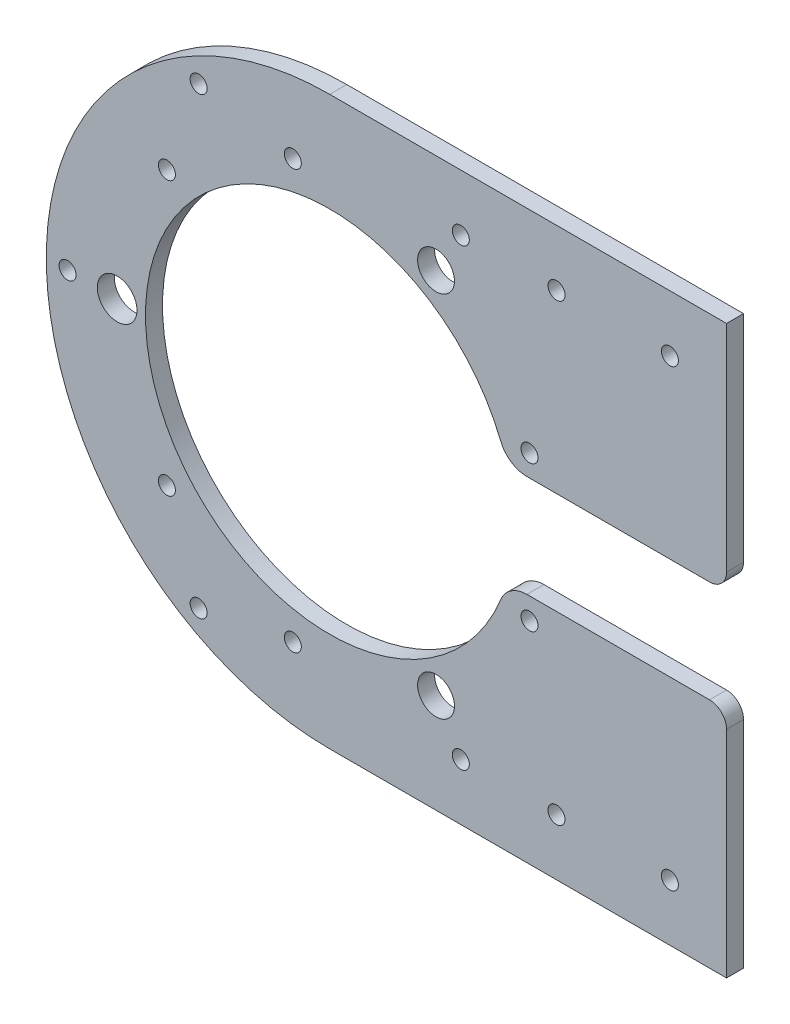
ISO-10303-21;
HEADER;
FILE_DESCRIPTION(('STEP AP214'),'2;1');
FILE_NAME('part.step','',(''),(''),'','','');
FILE_SCHEMA(('AUTOMOTIVE_DESIGN { 1 0 10303 214 1 1 1 1 }'));
ENDSEC;
DATA;
#1=APPLICATION_CONTEXT('core data for automotive mechanical design processes');
#2=APPLICATION_PROTOCOL_DEFINITION('international standard','automotive_design',2000,#1);
#3=PRODUCT_CONTEXT('',#1,'mechanical');
#4=PRODUCT('Part','Part','',(#3));
#5=PRODUCT_RELATED_PRODUCT_CATEGORY('part','',(#4));
#6=PRODUCT_DEFINITION_FORMATION('','',#4);
#7=PRODUCT_DEFINITION_CONTEXT('part definition',#1,'design');
#8=PRODUCT_DEFINITION('design','',#6,#7);
#9=PRODUCT_DEFINITION_SHAPE('','',#8);
#10=(LENGTH_UNIT() NAMED_UNIT(*) SI_UNIT(.MILLI.,.METRE.));
#11=(NAMED_UNIT(*) PLANE_ANGLE_UNIT() SI_UNIT($,.RADIAN.));
#12=(NAMED_UNIT(*) SI_UNIT($,.STERADIAN.) SOLID_ANGLE_UNIT());
#13=UNCERTAINTY_MEASURE_WITH_UNIT(LENGTH_MEASURE(1.E-05),#10,'distance_accuracy_value','');
#14=(GEOMETRIC_REPRESENTATION_CONTEXT(3) GLOBAL_UNCERTAINTY_ASSIGNED_CONTEXT((#13)) GLOBAL_UNIT_ASSIGNED_CONTEXT((#10,
#11,#12)) REPRESENTATION_CONTEXT('',''));
#15=CARTESIAN_POINT('',(0.,0.,0.));
#16=DIRECTION('',(0.,0.,1.));
#17=DIRECTION('',(1.,0.,0.));
#18=AXIS2_PLACEMENT_3D('',#15,#16,#17);
#19=CARTESIAN_POINT('',(-280.,0.,-7.));
#20=DIRECTION('',(1.,0.,0.));
#21=DIRECTION('',(0.,0.,-1.));
#22=AXIS2_PLACEMENT_3D('',#19,#20,#21);
#23=PLANE('',#22);
#24=DIRECTION('',(0.,1.,0.));
#25=VECTOR('',#24,1.);
#26=CARTESIAN_POINT('',(-280.,0.,3.));
#27=LINE('',#26,#25);
#28=CARTESIAN_POINT('',(-280.,12.,3.));
#29=VERTEX_POINT('',#28);
#30=CARTESIAN_POINT('',(-280.,50.,3.));
#31=VERTEX_POINT('',#30);
#32=EDGE_CURVE('E140',#29,#31,#27,.T.);
#33=ORIENTED_EDGE('',*,*,#32,.F.);
#34=DIRECTION('',(0.,0.,1.));
#35=VECTOR('',#34,1.);
#36=CARTESIAN_POINT('',(-280.,12.,0.));
#37=LINE('',#36,#35);
#38=CARTESIAN_POINT('',(-280.,12.,0.));
#39=VERTEX_POINT('',#38);
#40=EDGE_CURVE('E11',#29,#39,#37,.F.);
#41=ORIENTED_EDGE('',*,*,#40,.T.);
#42=DIRECTION('',(0.,1.,0.));
#43=VECTOR('',#42,1.);
#44=CARTESIAN_POINT('',(-280.,0.,0.));
#45=LINE('',#44,#43);
#46=CARTESIAN_POINT('',(-280.,50.,0.));
#47=VERTEX_POINT('',#46);
#48=EDGE_CURVE('E248',#39,#47,#45,.T.);
#49=ORIENTED_EDGE('',*,*,#48,.T.);
#50=DIRECTION('',(0.,0.,1.));
#51=VECTOR('',#50,1.);
#52=CARTESIAN_POINT('',(-280.,50.,-7.));
#53=LINE('',#52,#51);
#54=EDGE_CURVE('E149',#47,#31,#53,.T.);
#55=ORIENTED_EDGE('',*,*,#54,.T.);
#56=EDGE_LOOP('',(#33,#41,#49,#55));
#57=FACE_BOUND('',#56,.T.);
#58=ADVANCED_FACE('F43',(#57),#23,.T.);
#59=CARTESIAN_POINT('',(0.,50.,3.));
#60=DIRECTION('',(0.,-1.,0.));
#61=DIRECTION('',(1.,0.,0.));
#62=AXIS2_PLACEMENT_3D('',#59,#60,#61);
#63=PLANE('',#62);
#64=ORIENTED_EDGE('',*,*,#54,.F.);
#65=DIRECTION('',(-1.,0.,0.));
#66=VECTOR('',#65,1.);
#67=CARTESIAN_POINT('',(0.,50.,0.));
#68=LINE('',#67,#66);
#69=CARTESIAN_POINT('',(-350.,50.,0.));
#70=VERTEX_POINT('',#69);
#71=EDGE_CURVE('E183',#47,#70,#68,.T.);
#72=ORIENTED_EDGE('',*,*,#71,.T.);
#73=DIRECTION('',(0.,0.,-1.));
#74=VECTOR('',#73,1.);
#75=CARTESIAN_POINT('',(-350.,50.,3.));
#76=LINE('',#75,#74);
#77=CARTESIAN_POINT('',(-350.,50.,3.));
#78=VERTEX_POINT('',#77);
#79=EDGE_CURVE('E212',#78,#70,#76,.T.);
#80=ORIENTED_EDGE('',*,*,#79,.F.);
#81=DIRECTION('',(-1.,0.,0.));
#82=VECTOR('',#81,1.);
#83=CARTESIAN_POINT('',(0.,50.,3.));
#84=LINE('',#83,#82);
#85=EDGE_CURVE('E161',#31,#78,#84,.T.);
#86=ORIENTED_EDGE('',*,*,#85,.F.);
#87=EDGE_LOOP('',(#64,#72,#80,#86));
#88=FACE_BOUND('',#87,.T.);
#89=ADVANCED_FACE('F286',(#88),#63,.F.);
#90=CARTESIAN_POINT('',(0.,-50.,3.));
#91=DIRECTION('',(0.,-1.,0.));
#92=DIRECTION('',(1.,0.,0.));
#93=AXIS2_PLACEMENT_3D('',#90,#91,#92);
#94=PLANE('',#93);
#95=DIRECTION('',(-1.,0.,0.));
#96=VECTOR('',#95,1.);
#97=CARTESIAN_POINT('',(0.,-50.,0.));
#98=LINE('',#97,#96);
#99=CARTESIAN_POINT('',(-280.,-50.,0.));
#100=VERTEX_POINT('',#99);
#101=CARTESIAN_POINT('',(-350.,-50.,0.));
#102=VERTEX_POINT('',#101);
#103=EDGE_CURVE('E148',#100,#102,#98,.T.);
#104=ORIENTED_EDGE('',*,*,#103,.F.);
#105=DIRECTION('',(0.,0.,1.));
#106=VECTOR('',#105,1.);
#107=CARTESIAN_POINT('',(-280.,-50.,-7.));
#108=LINE('',#107,#106);
#109=CARTESIAN_POINT('',(-280.,-50.,3.));
#110=VERTEX_POINT('',#109);
#111=EDGE_CURVE('E134',#100,#110,#108,.T.);
#112=ORIENTED_EDGE('',*,*,#111,.T.);
#113=DIRECTION('',(-1.,0.,0.));
#114=VECTOR('',#113,1.);
#115=CARTESIAN_POINT('',(0.,-50.,3.));
#116=LINE('',#115,#114);
#117=CARTESIAN_POINT('',(-350.,-50.,3.));
#118=VERTEX_POINT('',#117);
#119=EDGE_CURVE('E146',#110,#118,#116,.T.);
#120=ORIENTED_EDGE('',*,*,#119,.T.);
#121=DIRECTION('',(0.,0.,-1.));
#122=VECTOR('',#121,1.);
#123=CARTESIAN_POINT('',(-350.,-50.,3.));
#124=LINE('',#123,#122);
#125=EDGE_CURVE('E182',#118,#102,#124,.T.);
#126=ORIENTED_EDGE('',*,*,#125,.T.);
#127=EDGE_LOOP('',(#104,#112,#120,#126));
#128=FACE_BOUND('',#127,.T.);
#129=ADVANCED_FACE('F144',(#128),#94,.T.);
#130=CARTESIAN_POINT('',(0.,0.,3.));
#131=DIRECTION('',(0.,0.,1.));
#132=DIRECTION('',(1.,0.,0.));
#133=AXIS2_PLACEMENT_3D('',#130,#131,#132);
#134=PLANE('',#133);
#135=CARTESIAN_POINT('',(-280.,-12.,3.));
#136=VERTEX_POINT('',#135);
#137=EDGE_CURVE('E130',#110,#136,#27,.T.);
#138=ORIENTED_EDGE('',*,*,#137,.T.);
#139=CARTESIAN_POINT('',(-283.,-12.,3.));
#140=DIRECTION('',(0.,0.,1.));
#141=DIRECTION('',(1.,0.,0.));
#142=AXIS2_PLACEMENT_3D('',#139,#140,#141);
#143=CIRCLE('',#142,3.);
#144=CARTESIAN_POINT('',(-283.,-8.99999999999997,3.));
#145=VERTEX_POINT('',#144);
#146=EDGE_CURVE('E264',#136,#145,#143,.T.);
#147=ORIENTED_EDGE('',*,*,#146,.T.);
#148=DIRECTION('',(1.,0.,0.));
#149=VECTOR('',#148,1.);
#150=CARTESIAN_POINT('',(-325.5,-8.99999999999997,3.));
#151=LINE('',#150,#149);
#152=CARTESIAN_POINT('',(-315.211352426402,-8.99999999999997,3.));
#153=VERTEX_POINT('',#152);
#154=EDGE_CURVE('E274',#153,#145,#151,.T.);
#155=ORIENTED_EDGE('',*,*,#154,.F.);
#156=CARTESIAN_POINT('',(-315.211352426402,-14.,3.));
#157=DIRECTION('',(0.,0.,1.));
#158=DIRECTION('',(1.,0.,0.));
#159=AXIS2_PLACEMENT_3D('',#156,#157,#158);
#160=CIRCLE('',#159,5.);
#161=CARTESIAN_POINT('',(-319.849838769548,-12.1333333333333,3.));
#162=VERTEX_POINT('',#161);
#163=EDGE_CURVE('E235',#153,#162,#160,.T.);
#164=ORIENTED_EDGE('',*,*,#163,.T.);
#165=CARTESIAN_POINT('',(-350.,0.,3.));
#166=DIRECTION('',(0.,0.,1.));
#167=DIRECTION('',(1.,0.,0.));
#168=AXIS2_PLACEMENT_3D('',#165,#166,#167);
#169=CIRCLE('',#168,32.5);
#170=CARTESIAN_POINT('',(-319.849838769548,12.1333333333333,3.));
#171=VERTEX_POINT('',#170);
#172=EDGE_CURVE('E156',#171,#162,#169,.T.);
#173=ORIENTED_EDGE('',*,*,#172,.F.);
#174=CARTESIAN_POINT('',(-315.211352426402,14.,3.));
#175=DIRECTION('',(0.,0.,1.));
#176=DIRECTION('',(1.,0.,0.));
#177=AXIS2_PLACEMENT_3D('',#174,#175,#176);
#178=CIRCLE('',#177,5.);
#179=CARTESIAN_POINT('',(-315.211352426402,9.00000000000003,3.));
#180=VERTEX_POINT('',#179);
#181=EDGE_CURVE('E232',#171,#180,#178,.T.);
#182=ORIENTED_EDGE('',*,*,#181,.T.);
#183=DIRECTION('',(-1.,0.,0.));
#184=VECTOR('',#183,1.);
#185=CARTESIAN_POINT('',(-325.5,9.00000000000003,3.));
#186=LINE('',#185,#184);
#187=CARTESIAN_POINT('',(-283.,9.00000000000003,3.));
#188=VERTEX_POINT('',#187);
#189=EDGE_CURVE('E268',#188,#180,#186,.T.);
#190=ORIENTED_EDGE('',*,*,#189,.F.);
#191=CARTESIAN_POINT('',(-283.,12.,3.));
#192=DIRECTION('',(0.,0.,1.));
#193=DIRECTION('',(1.,0.,0.));
#194=AXIS2_PLACEMENT_3D('',#191,#192,#193);
#195=CIRCLE('',#194,3.);
#196=EDGE_CURVE('E58',#188,#29,#195,.T.);
#197=ORIENTED_EDGE('',*,*,#196,.T.);
#198=ORIENTED_EDGE('',*,*,#32,.T.);
#199=ORIENTED_EDGE('',*,*,#85,.T.);
#200=CARTESIAN_POINT('',(-350.,0.,3.));
#201=DIRECTION('',(0.,0.,1.));
#202=DIRECTION('',(1.,0.,0.));
#203=AXIS2_PLACEMENT_3D('',#200,#201,#202);
#204=CIRCLE('',#203,50.);
#205=EDGE_CURVE('E154',#78,#118,#204,.T.);
#206=ORIENTED_EDGE('',*,*,#205,.T.);
#207=ORIENTED_EDGE('',*,*,#119,.F.);
#208=EDGE_LOOP('',(#138,#147,#155,#164,#173,#182,#190,#197,#198,#199,#206,#207));
#209=FACE_BOUND('',#208,.T.);
#210=CARTESIAN_POINT('',(-289.987080035835,40.0504203432088,3.));
#211=DIRECTION('',(0.,0.,1.));
#212=DIRECTION('',(1.,0.,0.));
#213=AXIS2_PLACEMENT_3D('',#210,#211,#212);
#214=CIRCLE('',#213,1.49999999999997);
#215=CARTESIAN_POINT('',(-288.487080035835,40.0504203432088,3.));
#216=VERTEX_POINT('',#215);
#217=EDGE_CURVE('E440',#216,#216,#214,.T.);
#218=ORIENTED_EDGE('',*,*,#217,.F.);
#219=EDGE_LOOP('',(#218));
#220=FACE_BOUND('',#219,.T.);
#221=CARTESIAN_POINT('',(-309.998951454997,-40.0509460122114,3.));
#222=DIRECTION('',(0.,0.,1.));
#223=DIRECTION('',(1.,0.,0.));
#224=AXIS2_PLACEMENT_3D('',#221,#222,#223);
#225=CIRCLE('',#224,1.50000000000002);
#226=CARTESIAN_POINT('',(-308.498951454997,-40.0509460122114,3.));
#227=VERTEX_POINT('',#226);
#228=EDGE_CURVE('E446',#227,#227,#225,.T.);
#229=ORIENTED_EDGE('',*,*,#228,.F.);
#230=EDGE_LOOP('',(#229));
#231=FACE_BOUND('',#230,.T.);
#232=CARTESIAN_POINT('',(-289.998951461851,-40.0504224134335,3.));
#233=DIRECTION('',(0.,0.,1.));
#234=DIRECTION('',(1.,0.,0.));
#235=AXIS2_PLACEMENT_3D('',#232,#233,#234);
#236=CIRCLE('',#235,1.50000000000002);
#237=CARTESIAN_POINT('',(-288.498951461851,-40.0504224134335,3.));
#238=VERTEX_POINT('',#237);
#239=EDGE_CURVE('E447',#238,#238,#236,.T.);
#240=ORIENTED_EDGE('',*,*,#239,.F.);
#241=EDGE_LOOP('',(#240));
#242=FACE_BOUND('',#241,.T.);
#243=CARTESIAN_POINT('',(-309.987078995179,40.0568721820884,3.));
#244=DIRECTION('',(0.,0.,1.));
#245=DIRECTION('',(1.,0.,0.));
#246=AXIS2_PLACEMENT_3D('',#243,#244,#245);
#247=CIRCLE('',#246,1.50000000000002);
#248=CARTESIAN_POINT('',(-308.487078995179,40.0568721820884,3.));
#249=VERTEX_POINT('',#248);
#250=EDGE_CURVE('E437',#249,#249,#247,.T.);
#251=ORIENTED_EDGE('',*,*,#250,.F.);
#252=EDGE_LOOP('',(#251));
#253=FACE_BOUND('',#252,.T.);
#254=CARTESIAN_POINT('',(-373.125000000001,-40.05367492503,3.));
#255=DIRECTION('',(0.,0.,1.));
#256=DIRECTION('',(1.,0.,0.));
#257=AXIS2_PLACEMENT_3D('',#254,#255,#256);
#258=CIRCLE('',#257,1.49999999999998);
#259=CARTESIAN_POINT('',(-371.625,-40.05367492503,3.));
#260=VERTEX_POINT('',#259);
#261=EDGE_CURVE('E421',#260,#260,#258,.T.);
#262=ORIENTED_EDGE('',*,*,#261,.F.);
#263=EDGE_LOOP('',(#262));
#264=FACE_BOUND('',#263,.T.);
#265=CARTESIAN_POINT('',(-326.875,-40.0536749250305,3.));
#266=DIRECTION('',(0.,0.,1.));
#267=DIRECTION('',(1.,0.,0.));
#268=AXIS2_PLACEMENT_3D('',#265,#266,#267);
#269=CIRCLE('',#268,1.49999999999995);
#270=CARTESIAN_POINT('',(-325.375000000001,-40.0536749250305,3.));
#271=VERTEX_POINT('',#270);
#272=EDGE_CURVE('E414',#271,#271,#269,.T.);
#273=ORIENTED_EDGE('',*,*,#272,.F.);
#274=EDGE_LOOP('',(#273));
#275=FACE_BOUND('',#274,.T.);
#276=CARTESIAN_POINT('',(-326.875,40.0536749250302,3.));
#277=DIRECTION('',(0.,0.,1.));
#278=DIRECTION('',(1.,0.,0.));
#279=AXIS2_PLACEMENT_3D('',#276,#277,#278);
#280=CIRCLE('',#279,1.49999999999998);
#281=CARTESIAN_POINT('',(-325.375,40.0536749250302,3.));
#282=VERTEX_POINT('',#281);
#283=EDGE_CURVE('E419',#282,#282,#280,.T.);
#284=ORIENTED_EDGE('',*,*,#283,.F.);
#285=EDGE_LOOP('',(#284));
#286=FACE_BOUND('',#285,.T.);
#287=CARTESIAN_POINT('',(-373.125,40.0536749250303,3.));
#288=DIRECTION('',(0.,0.,1.));
#289=DIRECTION('',(1.,0.,0.));
#290=AXIS2_PLACEMENT_3D('',#287,#288,#289);
#291=CIRCLE('',#290,1.49999999999995);
#292=CARTESIAN_POINT('',(-371.625,40.0536749250303,3.));
#293=VERTEX_POINT('',#292);
#294=EDGE_CURVE('E428',#293,#293,#291,.T.);
#295=ORIENTED_EDGE('',*,*,#294,.F.);
#296=EDGE_LOOP('',(#295));
#297=FACE_BOUND('',#296,.T.);
#298=CARTESIAN_POINT('',(-396.25,0.,3.));
#299=DIRECTION('',(0.,0.,1.));
#300=DIRECTION('',(1.,0.,0.));
#301=AXIS2_PLACEMENT_3D('',#298,#299,#300);
#302=CIRCLE('',#301,1.49999999999997);
#303=CARTESIAN_POINT('',(-394.75,0.,3.));
#304=VERTEX_POINT('',#303);
#305=EDGE_CURVE('E255',#304,#304,#302,.T.);
#306=ORIENTED_EDGE('',*,*,#305,.F.);
#307=EDGE_LOOP('',(#306));
#308=FACE_BOUND('',#307,.T.);
#309=CARTESIAN_POINT('',(-378.726666616962,24.1045353632453,3.));
#310=DIRECTION('',(0.,0.,1.));
#311=DIRECTION('',(1.,0.,0.));
#312=AXIS2_PLACEMENT_3D('',#309,#310,#311);
#313=CIRCLE('',#312,1.50000000000007);
#314=CARTESIAN_POINT('',(-377.226666616962,24.1045353632453,3.));
#315=VERTEX_POINT('',#314);
#316=EDGE_CURVE('E179',#315,#315,#313,.T.);
#317=ORIENTED_EDGE('',*,*,#316,.F.);
#318=EDGE_LOOP('',(#317));
#319=FACE_BOUND('',#318,.T.);
#320=CARTESIAN_POINT('',(-356.51180666251,36.9302907379578,3.));
#321=DIRECTION('',(0.,0.,1.));
#322=DIRECTION('',(1.,0.,0.));
#323=AXIS2_PLACEMENT_3D('',#320,#321,#322);
#324=CIRCLE('',#323,1.50000000000004);
#325=CARTESIAN_POINT('',(-355.01180666251,36.9302907379578,3.));
#326=VERTEX_POINT('',#325);
#327=EDGE_CURVE('E176',#326,#326,#324,.T.);
#328=ORIENTED_EDGE('',*,*,#327,.F.);
#329=EDGE_LOOP('',(#328));
#330=FACE_BOUND('',#329,.T.);
#331=CARTESIAN_POINT('',(-314.761526720528,12.8257553747124,3.));
#332=DIRECTION('',(0.,0.,1.));
#333=DIRECTION('',(1.,0.,0.));
#334=AXIS2_PLACEMENT_3D('',#331,#332,#333);
#335=CIRCLE('',#334,1.50000000000004);
#336=CARTESIAN_POINT('',(-313.261526720528,12.8257553747124,3.));
#337=VERTEX_POINT('',#336);
#338=EDGE_CURVE('E173',#337,#337,#335,.T.);
#339=ORIENTED_EDGE('',*,*,#338,.F.);
#340=EDGE_LOOP('',(#339));
#341=FACE_BOUND('',#340,.T.);
#342=CARTESIAN_POINT('',(-314.761526720528,-12.8257553747129,3.));
#343=DIRECTION('',(0.,0.,1.));
#344=DIRECTION('',(1.,0.,0.));
#345=AXIS2_PLACEMENT_3D('',#342,#343,#344);
#346=CIRCLE('',#345,1.49999999999999);
#347=CARTESIAN_POINT('',(-313.261526720528,-12.8257553747129,3.));
#348=VERTEX_POINT('',#347);
#349=EDGE_CURVE('E170',#348,#348,#346,.T.);
#350=ORIENTED_EDGE('',*,*,#349,.F.);
#351=EDGE_LOOP('',(#350));
#352=FACE_BOUND('',#351,.T.);
#353=CARTESIAN_POINT('',(-356.51180666251,-36.9302907379578,3.));
#354=DIRECTION('',(0.,0.,1.));
#355=DIRECTION('',(1.,0.,0.));
#356=AXIS2_PLACEMENT_3D('',#353,#354,#355);
#357=CIRCLE('',#356,1.49999999999999);
#358=CARTESIAN_POINT('',(-355.01180666251,-36.9302907379578,3.));
#359=VERTEX_POINT('',#358);
#360=EDGE_CURVE('E167',#359,#359,#357,.T.);
#361=ORIENTED_EDGE('',*,*,#360,.F.);
#362=EDGE_LOOP('',(#361));
#363=FACE_BOUND('',#362,.T.);
#364=CARTESIAN_POINT('',(-378.726666616962,-24.1045353632449,3.));
#365=DIRECTION('',(0.,0.,1.));
#366=DIRECTION('',(1.,0.,0.));
#367=AXIS2_PLACEMENT_3D('',#364,#365,#366);
#368=CIRCLE('',#367,1.50000000000003);
#369=CARTESIAN_POINT('',(-377.226666616962,-24.1045353632449,3.));
#370=VERTEX_POINT('',#369);
#371=EDGE_CURVE('E159',#370,#370,#368,.T.);
#372=ORIENTED_EDGE('',*,*,#371,.F.);
#373=EDGE_LOOP('',(#372));
#374=FACE_BOUND('',#373,.T.);
#375=CARTESIAN_POINT('',(-331.249149787925,-32.4754617569385,3.));
#376=DIRECTION('',(0.,0.,1.));
#377=DIRECTION('',(1.,0.,0.));
#378=AXIS2_PLACEMENT_3D('',#375,#376,#377);
#379=CIRCLE('',#378,3.24999999997268);
#380=CARTESIAN_POINT('',(-327.999149787953,-32.4754617569385,3.));
#381=VERTEX_POINT('',#380);
#382=EDGE_CURVE('E273',#381,#381,#379,.T.);
#383=ORIENTED_EDGE('',*,*,#382,.F.);
#384=EDGE_LOOP('',(#383));
#385=FACE_BOUND('',#384,.T.);
#386=CARTESIAN_POINT('',(-331.250850224812,32.4764435046127,3.));
#387=DIRECTION('',(0.,0.,1.));
#388=DIRECTION('',(1.,0.,0.));
#389=AXIS2_PLACEMENT_3D('',#386,#387,#388);
#390=CIRCLE('',#389,3.24999999997262);
#391=CARTESIAN_POINT('',(-328.000850224839,32.4764435046127,3.));
#392=VERTEX_POINT('',#391);
#393=EDGE_CURVE('E277',#392,#392,#390,.T.);
#394=ORIENTED_EDGE('',*,*,#393,.F.);
#395=EDGE_LOOP('',(#394));
#396=FACE_BOUND('',#395,.T.);
#397=CARTESIAN_POINT('',(-387.499999987108,-0.000981747714616944,3.));
#398=DIRECTION('',(0.,0.,1.));
#399=DIRECTION('',(1.,0.,0.));
#400=AXIS2_PLACEMENT_3D('',#397,#398,#399);
#401=CIRCLE('',#400,3.50000000000002);
#402=CARTESIAN_POINT('',(-383.999999987108,-0.000981747714616944,3.));
#403=VERTEX_POINT('',#402);
#404=EDGE_CURVE('E225',#403,#403,#401,.T.);
#405=ORIENTED_EDGE('',*,*,#404,.F.);
#406=EDGE_LOOP('',(#405));
#407=FACE_BOUND('',#406,.T.);
#408=ADVANCED_FACE('F151',(#209,#220,#231,#242,#253,#264,#275,#286,#297,#308,#319,#330,#341,
#352,#363,#374,#385,#396,#407),#134,.T.);
#409=CARTESIAN_POINT('',(0.,0.,0.));
#410=DIRECTION('',(0.,0.,1.));
#411=DIRECTION('',(1.,0.,0.));
#412=AXIS2_PLACEMENT_3D('',#409,#410,#411);
#413=PLANE('',#412);
#414=CARTESIAN_POINT('',(-289.987080035835,40.0504203432088,0.));
#415=DIRECTION('',(0.,0.,1.));
#416=DIRECTION('',(1.,0.,0.));
#417=AXIS2_PLACEMENT_3D('',#414,#415,#416);
#418=CIRCLE('',#417,1.49999999999997);
#419=CARTESIAN_POINT('',(-288.487080035835,40.0504203432088,0.));
#420=VERTEX_POINT('',#419);
#421=EDGE_CURVE('E450',#420,#420,#418,.T.);
#422=ORIENTED_EDGE('',*,*,#421,.T.);
#423=EDGE_LOOP('',(#422));
#424=FACE_BOUND('',#423,.T.);
#425=CARTESIAN_POINT('',(-309.998951454997,-40.0509460122114,0.));
#426=DIRECTION('',(0.,0.,1.));
#427=DIRECTION('',(1.,0.,0.));
#428=AXIS2_PLACEMENT_3D('',#425,#426,#427);
#429=CIRCLE('',#428,1.50000000000002);
#430=CARTESIAN_POINT('',(-308.498951454997,-40.0509460122114,0.));
#431=VERTEX_POINT('',#430);
#432=EDGE_CURVE('E443',#431,#431,#429,.T.);
#433=ORIENTED_EDGE('',*,*,#432,.T.);
#434=EDGE_LOOP('',(#433));
#435=FACE_BOUND('',#434,.T.);
#436=CARTESIAN_POINT('',(-289.998951461851,-40.0504224134335,0.));
#437=DIRECTION('',(0.,0.,1.));
#438=DIRECTION('',(1.,0.,0.));
#439=AXIS2_PLACEMENT_3D('',#436,#437,#438);
#440=CIRCLE('',#439,1.50000000000002);
#441=CARTESIAN_POINT('',(-288.498951461851,-40.0504224134335,0.));
#442=VERTEX_POINT('',#441);
#443=EDGE_CURVE('E454',#442,#442,#440,.T.);
#444=ORIENTED_EDGE('',*,*,#443,.T.);
#445=EDGE_LOOP('',(#444));
#446=FACE_BOUND('',#445,.T.);
#447=CARTESIAN_POINT('',(-309.987078995179,40.0568721820884,0.));
#448=DIRECTION('',(0.,0.,1.));
#449=DIRECTION('',(1.,0.,0.));
#450=AXIS2_PLACEMENT_3D('',#447,#448,#449);
#451=CIRCLE('',#450,1.50000000000002);
#452=CARTESIAN_POINT('',(-308.487078995179,40.0568721820884,0.));
#453=VERTEX_POINT('',#452);
#454=EDGE_CURVE('E434',#453,#453,#451,.T.);
#455=ORIENTED_EDGE('',*,*,#454,.T.);
#456=EDGE_LOOP('',(#455));
#457=FACE_BOUND('',#456,.T.);
#458=CARTESIAN_POINT('',(-373.125000000001,-40.05367492503,0.));
#459=DIRECTION('',(0.,0.,1.));
#460=DIRECTION('',(1.,0.,0.));
#461=AXIS2_PLACEMENT_3D('',#458,#459,#460);
#462=CIRCLE('',#461,1.49999999999998);
#463=CARTESIAN_POINT('',(-371.625,-40.05367492503,0.));
#464=VERTEX_POINT('',#463);
#465=EDGE_CURVE('E431',#464,#464,#462,.T.);
#466=ORIENTED_EDGE('',*,*,#465,.T.);
#467=EDGE_LOOP('',(#466));
#468=FACE_BOUND('',#467,.T.);
#469=CARTESIAN_POINT('',(-326.875,-40.0536749250305,0.));
#470=DIRECTION('',(0.,0.,1.));
#471=DIRECTION('',(1.,0.,0.));
#472=AXIS2_PLACEMENT_3D('',#469,#470,#471);
#473=CIRCLE('',#472,1.49999999999995);
#474=CARTESIAN_POINT('',(-325.375000000001,-40.0536749250305,0.));
#475=VERTEX_POINT('',#474);
#476=EDGE_CURVE('E411',#475,#475,#473,.T.);
#477=ORIENTED_EDGE('',*,*,#476,.T.);
#478=EDGE_LOOP('',(#477));
#479=FACE_BOUND('',#478,.T.);
#480=CARTESIAN_POINT('',(-326.875,40.0536749250302,0.));
#481=DIRECTION('',(0.,0.,1.));
#482=DIRECTION('',(1.,0.,0.));
#483=AXIS2_PLACEMENT_3D('',#480,#481,#482);
#484=CIRCLE('',#483,1.49999999999998);
#485=CARTESIAN_POINT('',(-325.375,40.0536749250302,0.));
#486=VERTEX_POINT('',#485);
#487=EDGE_CURVE('E416',#486,#486,#484,.T.);
#488=ORIENTED_EDGE('',*,*,#487,.T.);
#489=EDGE_LOOP('',(#488));
#490=FACE_BOUND('',#489,.T.);
#491=CARTESIAN_POINT('',(-373.125,40.0536749250303,0.));
#492=DIRECTION('',(0.,0.,1.));
#493=DIRECTION('',(1.,0.,0.));
#494=AXIS2_PLACEMENT_3D('',#491,#492,#493);
#495=CIRCLE('',#494,1.49999999999995);
#496=CARTESIAN_POINT('',(-371.625,40.0536749250303,0.));
#497=VERTEX_POINT('',#496);
#498=EDGE_CURVE('E425',#497,#497,#495,.T.);
#499=ORIENTED_EDGE('',*,*,#498,.T.);
#500=EDGE_LOOP('',(#499));
#501=FACE_BOUND('',#500,.T.);
#502=CARTESIAN_POINT('',(-396.25,0.,0.));
#503=DIRECTION('',(0.,0.,1.));
#504=DIRECTION('',(1.,0.,0.));
#505=AXIS2_PLACEMENT_3D('',#502,#503,#504);
#506=CIRCLE('',#505,1.49999999999997);
#507=CARTESIAN_POINT('',(-394.75,0.,0.));
#508=VERTEX_POINT('',#507);
#509=EDGE_CURVE('E252',#508,#508,#506,.T.);
#510=ORIENTED_EDGE('',*,*,#509,.T.);
#511=EDGE_LOOP('',(#510));
#512=FACE_BOUND('',#511,.T.);
#513=CARTESIAN_POINT('',(-378.726666616962,24.1045353632453,0.));
#514=DIRECTION('',(0.,0.,1.));
#515=DIRECTION('',(1.,0.,0.));
#516=AXIS2_PLACEMENT_3D('',#513,#514,#515);
#517=CIRCLE('',#516,1.50000000000007);
#518=CARTESIAN_POINT('',(-377.226666616962,24.1045353632453,0.));
#519=VERTEX_POINT('',#518);
#520=EDGE_CURVE('E208',#519,#519,#517,.T.);
#521=ORIENTED_EDGE('',*,*,#520,.T.);
#522=EDGE_LOOP('',(#521));
#523=FACE_BOUND('',#522,.T.);
#524=CARTESIAN_POINT('',(-356.51180666251,36.9302907379578,0.));
#525=DIRECTION('',(0.,0.,1.));
#526=DIRECTION('',(1.,0.,0.));
#527=AXIS2_PLACEMENT_3D('',#524,#525,#526);
#528=CIRCLE('',#527,1.50000000000004);
#529=CARTESIAN_POINT('',(-355.01180666251,36.9302907379578,0.));
#530=VERTEX_POINT('',#529);
#531=EDGE_CURVE('E205',#530,#530,#528,.T.);
#532=ORIENTED_EDGE('',*,*,#531,.T.);
#533=EDGE_LOOP('',(#532));
#534=FACE_BOUND('',#533,.T.);
#535=CARTESIAN_POINT('',(-314.761526720528,12.8257553747124,0.));
#536=DIRECTION('',(0.,0.,1.));
#537=DIRECTION('',(1.,0.,0.));
#538=AXIS2_PLACEMENT_3D('',#535,#536,#537);
#539=CIRCLE('',#538,1.50000000000004);
#540=CARTESIAN_POINT('',(-313.261526720528,12.8257553747124,0.));
#541=VERTEX_POINT('',#540);
#542=EDGE_CURVE('E202',#541,#541,#539,.T.);
#543=ORIENTED_EDGE('',*,*,#542,.T.);
#544=EDGE_LOOP('',(#543));
#545=FACE_BOUND('',#544,.T.);
#546=CARTESIAN_POINT('',(-314.761526720528,-12.8257553747129,0.));
#547=DIRECTION('',(0.,0.,1.));
#548=DIRECTION('',(1.,0.,0.));
#549=AXIS2_PLACEMENT_3D('',#546,#547,#548);
#550=CIRCLE('',#549,1.49999999999999);
#551=CARTESIAN_POINT('',(-313.261526720528,-12.8257553747129,0.));
#552=VERTEX_POINT('',#551);
#553=EDGE_CURVE('E199',#552,#552,#550,.T.);
#554=ORIENTED_EDGE('',*,*,#553,.T.);
#555=EDGE_LOOP('',(#554));
#556=FACE_BOUND('',#555,.T.);
#557=CARTESIAN_POINT('',(-356.51180666251,-36.9302907379578,0.));
#558=DIRECTION('',(0.,0.,1.));
#559=DIRECTION('',(1.,0.,0.));
#560=AXIS2_PLACEMENT_3D('',#557,#558,#559);
#561=CIRCLE('',#560,1.49999999999999);
#562=CARTESIAN_POINT('',(-355.01180666251,-36.9302907379578,0.));
#563=VERTEX_POINT('',#562);
#564=EDGE_CURVE('E196',#563,#563,#561,.T.);
#565=ORIENTED_EDGE('',*,*,#564,.T.);
#566=EDGE_LOOP('',(#565));
#567=FACE_BOUND('',#566,.T.);
#568=CARTESIAN_POINT('',(-378.726666616962,-24.1045353632449,0.));
#569=DIRECTION('',(0.,0.,1.));
#570=DIRECTION('',(1.,0.,0.));
#571=AXIS2_PLACEMENT_3D('',#568,#569,#570);
#572=CIRCLE('',#571,1.50000000000003);
#573=CARTESIAN_POINT('',(-377.226666616962,-24.1045353632449,0.));
#574=VERTEX_POINT('',#573);
#575=EDGE_CURVE('E193',#574,#574,#572,.T.);
#576=ORIENTED_EDGE('',*,*,#575,.T.);
#577=EDGE_LOOP('',(#576));
#578=FACE_BOUND('',#577,.T.);
#579=DIRECTION('',(1.,0.,0.));
#580=VECTOR('',#579,1.);
#581=CARTESIAN_POINT('',(0.,-8.99999999999997,0.));
#582=LINE('',#581,#580);
#583=CARTESIAN_POINT('',(-315.211352426402,-8.99999999999997,0.));
#584=VERTEX_POINT('',#583);
#585=CARTESIAN_POINT('',(-283.,-8.99999999999997,0.));
#586=VERTEX_POINT('',#585);
#587=EDGE_CURVE('E217',#584,#586,#582,.T.);
#588=ORIENTED_EDGE('',*,*,#587,.T.);
#589=CARTESIAN_POINT('',(-283.,-12.,0.));
#590=DIRECTION('',(0.,0.,1.));
#591=DIRECTION('',(1.,0.,0.));
#592=AXIS2_PLACEMENT_3D('',#589,#590,#591);
#593=CIRCLE('',#592,3.);
#594=CARTESIAN_POINT('',(-280.,-12.,0.));
#595=VERTEX_POINT('',#594);
#596=EDGE_CURVE('E260',#586,#595,#593,.F.);
#597=ORIENTED_EDGE('',*,*,#596,.T.);
#598=EDGE_CURVE('E249',#100,#595,#45,.T.);
#599=ORIENTED_EDGE('',*,*,#598,.F.);
#600=ORIENTED_EDGE('',*,*,#103,.T.);
#601=CARTESIAN_POINT('',(-350.,0.,0.));
#602=DIRECTION('',(0.,0.,1.));
#603=DIRECTION('',(1.,0.,0.));
#604=AXIS2_PLACEMENT_3D('',#601,#602,#603);
#605=CIRCLE('',#604,50.);
#606=EDGE_CURVE('E185',#70,#102,#605,.T.);
#607=ORIENTED_EDGE('',*,*,#606,.F.);
#608=ORIENTED_EDGE('',*,*,#71,.F.);
#609=ORIENTED_EDGE('',*,*,#48,.F.);
#610=CARTESIAN_POINT('',(-283.,12.,0.));
#611=DIRECTION('',(0.,0.,1.));
#612=DIRECTION('',(1.,0.,0.));
#613=AXIS2_PLACEMENT_3D('',#610,#611,#612);
#614=CIRCLE('',#613,3.);
#615=CARTESIAN_POINT('',(-283.,9.00000000000003,0.));
#616=VERTEX_POINT('',#615);
#617=EDGE_CURVE('E258',#39,#616,#614,.F.);
#618=ORIENTED_EDGE('',*,*,#617,.T.);
#619=DIRECTION('',(-1.,0.,0.));
#620=VECTOR('',#619,1.);
#621=CARTESIAN_POINT('',(0.,9.00000000000003,0.));
#622=LINE('',#621,#620);
#623=CARTESIAN_POINT('',(-315.211352426402,9.00000000000003,0.));
#624=VERTEX_POINT('',#623);
#625=EDGE_CURVE('E215',#616,#624,#622,.T.);
#626=ORIENTED_EDGE('',*,*,#625,.T.);
#627=CARTESIAN_POINT('',(-315.211352426402,14.,0.));
#628=DIRECTION('',(0.,0.,1.));
#629=DIRECTION('',(1.,0.,0.));
#630=AXIS2_PLACEMENT_3D('',#627,#628,#629);
#631=CIRCLE('',#630,5.);
#632=CARTESIAN_POINT('',(-319.849838769548,12.1333333333333,0.));
#633=VERTEX_POINT('',#632);
#634=EDGE_CURVE('E241',#624,#633,#631,.F.);
#635=ORIENTED_EDGE('',*,*,#634,.T.);
#636=CARTESIAN_POINT('',(-350.,0.,0.));
#637=DIRECTION('',(0.,0.,1.));
#638=DIRECTION('',(1.,0.,0.));
#639=AXIS2_PLACEMENT_3D('',#636,#637,#638);
#640=CIRCLE('',#639,32.5);
#641=CARTESIAN_POINT('',(-319.849838769548,-12.1333333333333,0.));
#642=VERTEX_POINT('',#641);
#643=EDGE_CURVE('E190',#633,#642,#640,.T.);
#644=ORIENTED_EDGE('',*,*,#643,.T.);
#645=CARTESIAN_POINT('',(-315.211352426402,-14.,0.));
#646=DIRECTION('',(0.,0.,1.));
#647=DIRECTION('',(1.,0.,0.));
#648=AXIS2_PLACEMENT_3D('',#645,#646,#647);
#649=CIRCLE('',#648,5.);
#650=EDGE_CURVE('E243',#642,#584,#649,.F.);
#651=ORIENTED_EDGE('',*,*,#650,.T.);
#652=EDGE_LOOP('',(#588,#597,#599,#600,#607,#608,#609,#618,#626,#635,#644,#651));
#653=FACE_BOUND('',#652,.T.);
#654=CARTESIAN_POINT('',(-331.249149787925,-32.4754617569385,0.));
#655=DIRECTION('',(0.,0.,1.));
#656=DIRECTION('',(1.,0.,0.));
#657=AXIS2_PLACEMENT_3D('',#654,#655,#656);
#658=CIRCLE('',#657,3.24999999997268);
#659=CARTESIAN_POINT('',(-327.999149787953,-32.4754617569385,0.));
#660=VERTEX_POINT('',#659);
#661=EDGE_CURVE('E221',#660,#660,#658,.T.);
#662=ORIENTED_EDGE('',*,*,#661,.T.);
#663=EDGE_LOOP('',(#662));
#664=FACE_BOUND('',#663,.T.);
#665=CARTESIAN_POINT('',(-331.250850224812,32.4764435046127,0.));
#666=DIRECTION('',(0.,0.,1.));
#667=DIRECTION('',(1.,0.,0.));
#668=AXIS2_PLACEMENT_3D('',#665,#666,#667);
#669=CIRCLE('',#668,3.24999999997262);
#670=CARTESIAN_POINT('',(-328.000850224839,32.4764435046127,0.));
#671=VERTEX_POINT('',#670);
#672=EDGE_CURVE('E224',#671,#671,#669,.T.);
#673=ORIENTED_EDGE('',*,*,#672,.T.);
#674=EDGE_LOOP('',(#673));
#675=FACE_BOUND('',#674,.T.);
#676=CARTESIAN_POINT('',(-387.499999987108,-0.000981747714616944,0.));
#677=DIRECTION('',(0.,0.,1.));
#678=DIRECTION('',(1.,0.,0.));
#679=AXIS2_PLACEMENT_3D('',#676,#677,#678);
#680=CIRCLE('',#679,3.50000000000002);
#681=CARTESIAN_POINT('',(-383.999999987108,-0.000981747714616944,0.));
#682=VERTEX_POINT('',#681);
#683=EDGE_CURVE('E186',#682,#682,#680,.T.);
#684=ORIENTED_EDGE('',*,*,#683,.T.);
#685=EDGE_LOOP('',(#684));
#686=FACE_BOUND('',#685,.T.);
#687=ADVANCED_FACE('F292',(#424,#435,#446,#457,#468,#479,#490,#501,#512,#523,#534,#545,#556,
#567,#578,#653,#664,#675,#686),#413,.F.);
#688=CARTESIAN_POINT('',(-350.,0.,3.));
#689=DIRECTION('',(0.,0.,-1.));
#690=DIRECTION('',(-1.,0.,0.));
#691=AXIS2_PLACEMENT_3D('',#688,#689,#690);
#692=CYLINDRICAL_SURFACE('',#691,50.);
#693=ORIENTED_EDGE('',*,*,#606,.T.);
#694=ORIENTED_EDGE('',*,*,#125,.F.);
#695=ORIENTED_EDGE('',*,*,#205,.F.);
#696=ORIENTED_EDGE('',*,*,#79,.T.);
#697=EDGE_LOOP('',(#693,#694,#695,#696));
#698=FACE_BOUND('',#697,.T.);
#699=ADVANCED_FACE('F290',(#698),#692,.T.);
#700=CARTESIAN_POINT('',(-378.726666616962,24.1045353632453,3.));
#701=DIRECTION('',(0.,0.,-1.));
#702=DIRECTION('',(-1.,0.,0.));
#703=AXIS2_PLACEMENT_3D('',#700,#701,#702);
#704=CYLINDRICAL_SURFACE('',#703,1.50000000000007);
#705=ORIENTED_EDGE('',*,*,#316,.T.);
#706=EDGE_LOOP('',(#705));
#707=FACE_BOUND('',#706,.T.);
#708=ORIENTED_EDGE('',*,*,#520,.F.);
#709=EDGE_LOOP('',(#708));
#710=FACE_BOUND('',#709,.T.);
#711=ADVANCED_FACE('F344',(#707,#710),#704,.F.);
#712=CARTESIAN_POINT('',(-356.51180666251,36.9302907379578,3.));
#713=DIRECTION('',(0.,0.,-1.));
#714=DIRECTION('',(-1.,0.,0.));
#715=AXIS2_PLACEMENT_3D('',#712,#713,#714);
#716=CYLINDRICAL_SURFACE('',#715,1.50000000000004);
#717=ORIENTED_EDGE('',*,*,#327,.T.);
#718=EDGE_LOOP('',(#717));
#719=FACE_BOUND('',#718,.T.);
#720=ORIENTED_EDGE('',*,*,#531,.F.);
#721=EDGE_LOOP('',(#720));
#722=FACE_BOUND('',#721,.T.);
#723=ADVANCED_FACE('F720',(#719,#722),#716,.F.);
#724=CARTESIAN_POINT('',(-314.761526720528,12.8257553747124,3.));
#725=DIRECTION('',(0.,0.,-1.));
#726=DIRECTION('',(-1.,0.,0.));
#727=AXIS2_PLACEMENT_3D('',#724,#725,#726);
#728=CYLINDRICAL_SURFACE('',#727,1.50000000000004);
#729=ORIENTED_EDGE('',*,*,#338,.T.);
#730=EDGE_LOOP('',(#729));
#731=FACE_BOUND('',#730,.T.);
#732=ORIENTED_EDGE('',*,*,#542,.F.);
#733=EDGE_LOOP('',(#732));
#734=FACE_BOUND('',#733,.T.);
#735=ADVANCED_FACE('F709',(#731,#734),#728,.F.);
#736=CARTESIAN_POINT('',(-314.761526720528,-12.8257553747129,3.));
#737=DIRECTION('',(0.,0.,-1.));
#738=DIRECTION('',(-1.,0.,0.));
#739=AXIS2_PLACEMENT_3D('',#736,#737,#738);
#740=CYLINDRICAL_SURFACE('',#739,1.49999999999999);
#741=ORIENTED_EDGE('',*,*,#349,.T.);
#742=EDGE_LOOP('',(#741));
#743=FACE_BOUND('',#742,.T.);
#744=ORIENTED_EDGE('',*,*,#553,.F.);
#745=EDGE_LOOP('',(#744));
#746=FACE_BOUND('',#745,.T.);
#747=ADVANCED_FACE('F699',(#743,#746),#740,.F.);
#748=CARTESIAN_POINT('',(-356.51180666251,-36.9302907379578,3.));
#749=DIRECTION('',(0.,0.,-1.));
#750=DIRECTION('',(-1.,0.,0.));
#751=AXIS2_PLACEMENT_3D('',#748,#749,#750);
#752=CYLINDRICAL_SURFACE('',#751,1.49999999999999);
#753=ORIENTED_EDGE('',*,*,#360,.T.);
#754=EDGE_LOOP('',(#753));
#755=FACE_BOUND('',#754,.T.);
#756=ORIENTED_EDGE('',*,*,#564,.F.);
#757=EDGE_LOOP('',(#756));
#758=FACE_BOUND('',#757,.T.);
#759=ADVANCED_FACE('F510',(#755,#758),#752,.F.);
#760=CARTESIAN_POINT('',(-378.726666616962,-24.1045353632449,3.));
#761=DIRECTION('',(0.,0.,-1.));
#762=DIRECTION('',(-1.,0.,0.));
#763=AXIS2_PLACEMENT_3D('',#760,#761,#762);
#764=CYLINDRICAL_SURFACE('',#763,1.50000000000003);
#765=ORIENTED_EDGE('',*,*,#371,.T.);
#766=EDGE_LOOP('',(#765));
#767=FACE_BOUND('',#766,.T.);
#768=ORIENTED_EDGE('',*,*,#575,.F.);
#769=EDGE_LOOP('',(#768));
#770=FACE_BOUND('',#769,.T.);
#771=ADVANCED_FACE('F505',(#767,#770),#764,.F.);
#772=CARTESIAN_POINT('',(-350.,0.,3.));
#773=DIRECTION('',(0.,0.,-1.));
#774=DIRECTION('',(-1.,0.,0.));
#775=AXIS2_PLACEMENT_3D('',#772,#773,#774);
#776=CYLINDRICAL_SURFACE('',#775,32.5);
#777=ORIENTED_EDGE('',*,*,#172,.T.);
#778=DIRECTION('',(0.,0.,-1.));
#779=VECTOR('',#778,1.);
#780=CARTESIAN_POINT('',(-319.849838769548,-12.1333333333333,3.));
#781=LINE('',#780,#779);
#782=EDGE_CURVE('E239',#162,#642,#781,.T.);
#783=ORIENTED_EDGE('',*,*,#782,.T.);
#784=ORIENTED_EDGE('',*,*,#643,.F.);
#785=DIRECTION('',(0.,0.,-1.));
#786=VECTOR('',#785,1.);
#787=CARTESIAN_POINT('',(-319.849838769548,12.1333333333333,3.));
#788=LINE('',#787,#786);
#789=EDGE_CURVE('E237',#633,#171,#788,.F.);
#790=ORIENTED_EDGE('',*,*,#789,.T.);
#791=EDGE_LOOP('',(#777,#783,#784,#790));
#792=FACE_BOUND('',#791,.T.);
#793=ADVANCED_FACE('F308',(#792),#776,.F.);
#794=CARTESIAN_POINT('',(-325.5,-8.99999999999997,-7.));
#795=DIRECTION('',(0.,-1.,0.));
#796=DIRECTION('',(0.,0.,-1.));
#797=AXIS2_PLACEMENT_3D('',#794,#795,#796);
#798=PLANE('',#797);
#799=ORIENTED_EDGE('',*,*,#154,.T.);
#800=DIRECTION('',(0.,0.,-1.));
#801=VECTOR('',#800,1.);
#802=CARTESIAN_POINT('',(-283.,-8.99999999999997,0.));
#803=LINE('',#802,#801);
#804=EDGE_CURVE('E251',#145,#586,#803,.T.);
#805=ORIENTED_EDGE('',*,*,#804,.T.);
#806=ORIENTED_EDGE('',*,*,#587,.F.);
#807=DIRECTION('',(0.,0.,1.));
#808=VECTOR('',#807,1.);
#809=CARTESIAN_POINT('',(-315.211352426402,-8.99999999999997,3.));
#810=LINE('',#809,#808);
#811=EDGE_CURVE('E220',#584,#153,#810,.T.);
#812=ORIENTED_EDGE('',*,*,#811,.T.);
#813=EDGE_LOOP('',(#799,#805,#806,#812));
#814=FACE_BOUND('',#813,.T.);
#815=ADVANCED_FACE('F300',(#814),#798,.F.);
#816=CARTESIAN_POINT('',(-325.5,9.00000000000003,-7.));
#817=DIRECTION('',(0.,1.,0.));
#818=DIRECTION('',(0.,0.,1.));
#819=AXIS2_PLACEMENT_3D('',#816,#817,#818);
#820=PLANE('',#819);
#821=ORIENTED_EDGE('',*,*,#625,.F.);
#822=DIRECTION('',(0.,0.,1.));
#823=VECTOR('',#822,1.);
#824=CARTESIAN_POINT('',(-283.,9.00000000000003,3.));
#825=LINE('',#824,#823);
#826=EDGE_CURVE('E51',#616,#188,#825,.T.);
#827=ORIENTED_EDGE('',*,*,#826,.T.);
#828=ORIENTED_EDGE('',*,*,#189,.T.);
#829=DIRECTION('',(0.,0.,1.));
#830=VECTOR('',#829,1.);
#831=CARTESIAN_POINT('',(-315.211352426402,9.00000000000003,0.));
#832=LINE('',#831,#830);
#833=EDGE_CURVE('E245',#180,#624,#832,.F.);
#834=ORIENTED_EDGE('',*,*,#833,.T.);
#835=EDGE_LOOP('',(#821,#827,#828,#834));
#836=FACE_BOUND('',#835,.T.);
#837=ADVANCED_FACE('F267',(#836),#820,.F.);
#838=CARTESIAN_POINT('',(-331.249149787925,-32.4754617569385,-7.));
#839=DIRECTION('',(0.,0.,1.));
#840=DIRECTION('',(1.,0.,0.));
#841=AXIS2_PLACEMENT_3D('',#838,#839,#840);
#842=CYLINDRICAL_SURFACE('',#841,3.24999999997268);
#843=ORIENTED_EDGE('',*,*,#382,.T.);
#844=EDGE_LOOP('',(#843));
#845=FACE_BOUND('',#844,.T.);
#846=ORIENTED_EDGE('',*,*,#661,.F.);
#847=EDGE_LOOP('',(#846));
#848=FACE_BOUND('',#847,.T.);
#849=ADVANCED_FACE('F487',(#845,#848),#842,.F.);
#850=CARTESIAN_POINT('',(-331.250850224812,32.4764435046127,-7.));
#851=DIRECTION('',(0.,0.,1.));
#852=DIRECTION('',(1.,0.,0.));
#853=AXIS2_PLACEMENT_3D('',#850,#851,#852);
#854=CYLINDRICAL_SURFACE('',#853,3.24999999997262);
#855=ORIENTED_EDGE('',*,*,#393,.T.);
#856=EDGE_LOOP('',(#855));
#857=FACE_BOUND('',#856,.T.);
#858=ORIENTED_EDGE('',*,*,#672,.F.);
#859=EDGE_LOOP('',(#858));
#860=FACE_BOUND('',#859,.T.);
#861=ADVANCED_FACE('F324',(#857,#860),#854,.F.);
#862=CARTESIAN_POINT('',(-387.499999987108,-0.000981747714616944,-7.));
#863=DIRECTION('',(0.,0.,1.));
#864=DIRECTION('',(1.,0.,0.));
#865=AXIS2_PLACEMENT_3D('',#862,#863,#864);
#866=CYLINDRICAL_SURFACE('',#865,3.50000000000002);
#867=ORIENTED_EDGE('',*,*,#404,.T.);
#868=EDGE_LOOP('',(#867));
#869=FACE_BOUND('',#868,.T.);
#870=ORIENTED_EDGE('',*,*,#683,.F.);
#871=EDGE_LOOP('',(#870));
#872=FACE_BOUND('',#871,.T.);
#873=ADVANCED_FACE('F332',(#869,#872),#866,.F.);
#874=CARTESIAN_POINT('',(-315.211352426402,-14.,3.));
#875=DIRECTION('',(0.,0.,-1.));
#876=DIRECTION('',(-1.,0.,0.));
#877=AXIS2_PLACEMENT_3D('',#874,#875,#876);
#878=CYLINDRICAL_SURFACE('',#877,5.);
#879=ORIENTED_EDGE('',*,*,#650,.F.);
#880=ORIENTED_EDGE('',*,*,#782,.F.);
#881=ORIENTED_EDGE('',*,*,#163,.F.);
#882=ORIENTED_EDGE('',*,*,#811,.F.);
#883=EDGE_LOOP('',(#879,#880,#881,#882));
#884=FACE_BOUND('',#883,.T.);
#885=ADVANCED_FACE('F305',(#884),#878,.T.);
#886=CARTESIAN_POINT('',(-315.211352426402,14.,3.));
#887=DIRECTION('',(0.,0.,-1.));
#888=DIRECTION('',(-1.,0.,0.));
#889=AXIS2_PLACEMENT_3D('',#886,#887,#888);
#890=CYLINDRICAL_SURFACE('',#889,5.);
#891=ORIENTED_EDGE('',*,*,#181,.F.);
#892=ORIENTED_EDGE('',*,*,#789,.F.);
#893=ORIENTED_EDGE('',*,*,#634,.F.);
#894=ORIENTED_EDGE('',*,*,#833,.F.);
#895=EDGE_LOOP('',(#891,#892,#893,#894));
#896=FACE_BOUND('',#895,.T.);
#897=ADVANCED_FACE('F313',(#896),#890,.T.);
#898=ORIENTED_EDGE('',*,*,#598,.T.);
#899=DIRECTION('',(0.,0.,-1.));
#900=VECTOR('',#899,1.);
#901=CARTESIAN_POINT('',(-280.,-12.,3.));
#902=LINE('',#901,#900);
#903=EDGE_CURVE('E137',#595,#136,#902,.F.);
#904=ORIENTED_EDGE('',*,*,#903,.T.);
#905=ORIENTED_EDGE('',*,*,#137,.F.);
#906=ORIENTED_EDGE('',*,*,#111,.F.);
#907=EDGE_LOOP('',(#898,#904,#905,#906));
#908=FACE_BOUND('',#907,.T.);
#909=ADVANCED_FACE('F133',(#908),#23,.T.);
#910=CARTESIAN_POINT('',(-396.25,0.,-7.));
#911=DIRECTION('',(0.,0.,1.));
#912=DIRECTION('',(1.,0.,0.));
#913=AXIS2_PLACEMENT_3D('',#910,#911,#912);
#914=CYLINDRICAL_SURFACE('',#913,1.49999999999997);
#915=ORIENTED_EDGE('',*,*,#305,.T.);
#916=EDGE_LOOP('',(#915));
#917=FACE_BOUND('',#916,.T.);
#918=ORIENTED_EDGE('',*,*,#509,.F.);
#919=EDGE_LOOP('',(#918));
#920=FACE_BOUND('',#919,.T.);
#921=ADVANCED_FACE('F357',(#917,#920),#914,.F.);
#922=CARTESIAN_POINT('',(-373.125,40.0536749250303,0.));
#923=DIRECTION('',(0.,0.,1.));
#924=DIRECTION('',(1.,0.,0.));
#925=AXIS2_PLACEMENT_3D('',#922,#923,#924);
#926=CYLINDRICAL_SURFACE('',#925,1.49999999999995);
#927=ORIENTED_EDGE('',*,*,#498,.F.);
#928=EDGE_LOOP('',(#927));
#929=FACE_BOUND('',#928,.T.);
#930=ORIENTED_EDGE('',*,*,#294,.T.);
#931=EDGE_LOOP('',(#930));
#932=FACE_BOUND('',#931,.T.);
#933=ADVANCED_FACE('F362',(#929,#932),#926,.F.);
#934=CARTESIAN_POINT('',(-326.875,40.0536749250302,0.));
#935=DIRECTION('',(0.,0.,1.));
#936=DIRECTION('',(1.,0.,0.));
#937=AXIS2_PLACEMENT_3D('',#934,#935,#936);
#938=CYLINDRICAL_SURFACE('',#937,1.49999999999998);
#939=ORIENTED_EDGE('',*,*,#487,.F.);
#940=EDGE_LOOP('',(#939));
#941=FACE_BOUND('',#940,.T.);
#942=ORIENTED_EDGE('',*,*,#283,.T.);
#943=EDGE_LOOP('',(#942));
#944=FACE_BOUND('',#943,.T.);
#945=ADVANCED_FACE('F399',(#941,#944),#938,.F.);
#946=CARTESIAN_POINT('',(-326.875,-40.0536749250305,0.));
#947=DIRECTION('',(0.,0.,1.));
#948=DIRECTION('',(1.,0.,0.));
#949=AXIS2_PLACEMENT_3D('',#946,#947,#948);
#950=CYLINDRICAL_SURFACE('',#949,1.49999999999995);
#951=ORIENTED_EDGE('',*,*,#476,.F.);
#952=EDGE_LOOP('',(#951));
#953=FACE_BOUND('',#952,.T.);
#954=ORIENTED_EDGE('',*,*,#272,.T.);
#955=EDGE_LOOP('',(#954));
#956=FACE_BOUND('',#955,.T.);
#957=ADVANCED_FACE('F395',(#953,#956),#950,.F.);
#958=CARTESIAN_POINT('',(-373.125000000001,-40.05367492503,0.));
#959=DIRECTION('',(0.,0.,1.));
#960=DIRECTION('',(1.,0.,0.));
#961=AXIS2_PLACEMENT_3D('',#958,#959,#960);
#962=CYLINDRICAL_SURFACE('',#961,1.49999999999998);
#963=ORIENTED_EDGE('',*,*,#465,.F.);
#964=EDGE_LOOP('',(#963));
#965=FACE_BOUND('',#964,.T.);
#966=ORIENTED_EDGE('',*,*,#261,.T.);
#967=EDGE_LOOP('',(#966));
#968=FACE_BOUND('',#967,.T.);
#969=ADVANCED_FACE('F391',(#965,#968),#962,.F.);
#970=CARTESIAN_POINT('',(-309.987078995179,40.0568721820884,0.));
#971=DIRECTION('',(0.,0.,1.));
#972=DIRECTION('',(1.,0.,0.));
#973=AXIS2_PLACEMENT_3D('',#970,#971,#972);
#974=CYLINDRICAL_SURFACE('',#973,1.50000000000002);
#975=ORIENTED_EDGE('',*,*,#454,.F.);
#976=EDGE_LOOP('',(#975));
#977=FACE_BOUND('',#976,.T.);
#978=ORIENTED_EDGE('',*,*,#250,.T.);
#979=EDGE_LOOP('',(#978));
#980=FACE_BOUND('',#979,.T.);
#981=ADVANCED_FACE('F388',(#977,#980),#974,.F.);
#982=CARTESIAN_POINT('',(-289.998951461851,-40.0504224134335,0.));
#983=DIRECTION('',(0.,0.,1.));
#984=DIRECTION('',(1.,0.,0.));
#985=AXIS2_PLACEMENT_3D('',#982,#983,#984);
#986=CYLINDRICAL_SURFACE('',#985,1.50000000000002);
#987=ORIENTED_EDGE('',*,*,#443,.F.);
#988=EDGE_LOOP('',(#987));
#989=FACE_BOUND('',#988,.T.);
#990=ORIENTED_EDGE('',*,*,#239,.T.);
#991=EDGE_LOOP('',(#990));
#992=FACE_BOUND('',#991,.T.);
#993=ADVANCED_FACE('F381',(#989,#992),#986,.F.);
#994=CARTESIAN_POINT('',(-309.998951454997,-40.0509460122114,0.));
#995=DIRECTION('',(0.,0.,1.));
#996=DIRECTION('',(1.,0.,0.));
#997=AXIS2_PLACEMENT_3D('',#994,#995,#996);
#998=CYLINDRICAL_SURFACE('',#997,1.50000000000002);
#999=ORIENTED_EDGE('',*,*,#432,.F.);
#1000=EDGE_LOOP('',(#999));
#1001=FACE_BOUND('',#1000,.T.);
#1002=ORIENTED_EDGE('',*,*,#228,.T.);
#1003=EDGE_LOOP('',(#1002));
#1004=FACE_BOUND('',#1003,.T.);
#1005=ADVANCED_FACE('F375',(#1001,#1004),#998,.F.);
#1006=CARTESIAN_POINT('',(-289.987080035835,40.0504203432088,0.));
#1007=DIRECTION('',(0.,0.,1.));
#1008=DIRECTION('',(1.,0.,0.));
#1009=AXIS2_PLACEMENT_3D('',#1006,#1007,#1008);
#1010=CYLINDRICAL_SURFACE('',#1009,1.49999999999997);
#1011=ORIENTED_EDGE('',*,*,#421,.F.);
#1012=EDGE_LOOP('',(#1011));
#1013=FACE_BOUND('',#1012,.T.);
#1014=ORIENTED_EDGE('',*,*,#217,.T.);
#1015=EDGE_LOOP('',(#1014));
#1016=FACE_BOUND('',#1015,.T.);
#1017=ADVANCED_FACE('F370',(#1013,#1016),#1010,.F.);
#1018=CARTESIAN_POINT('',(-283.,-12.,-7.));
#1019=DIRECTION('',(0.,0.,1.));
#1020=DIRECTION('',(1.,0.,0.));
#1021=AXIS2_PLACEMENT_3D('',#1018,#1019,#1020);
#1022=CYLINDRICAL_SURFACE('',#1021,3.);
#1023=ORIENTED_EDGE('',*,*,#146,.F.);
#1024=ORIENTED_EDGE('',*,*,#903,.F.);
#1025=ORIENTED_EDGE('',*,*,#596,.F.);
#1026=ORIENTED_EDGE('',*,*,#804,.F.);
#1027=EDGE_LOOP('',(#1023,#1024,#1025,#1026));
#1028=FACE_BOUND('',#1027,.T.);
#1029=ADVANCED_FACE('F296',(#1028),#1022,.T.);
#1030=CARTESIAN_POINT('',(-283.,12.,-7.));
#1031=DIRECTION('',(0.,0.,-1.));
#1032=DIRECTION('',(-1.,0.,0.));
#1033=AXIS2_PLACEMENT_3D('',#1030,#1031,#1032);
#1034=CYLINDRICAL_SURFACE('',#1033,3.);
#1035=ORIENTED_EDGE('',*,*,#617,.F.);
#1036=ORIENTED_EDGE('',*,*,#40,.F.);
#1037=ORIENTED_EDGE('',*,*,#196,.F.);
#1038=ORIENTED_EDGE('',*,*,#826,.F.);
#1039=EDGE_LOOP('',(#1035,#1036,#1037,#1038));
#1040=FACE_BOUND('',#1039,.T.);
#1041=ADVANCED_FACE('F45',(#1040),#1034,.T.);
#1042=CLOSED_SHELL('',(#58,#89,#129,#408,#687,#699,#711,#723,#735,#747,#759,#771,#793,#815,#837,
#849,#861,#873,#885,#897,#909,#921,#933,#945,#957,#969,#981,#993,#1005,#1017,#1029,#1041));
#1043=MANIFOLD_SOLID_BREP('B2',#1042);
#1044=ADVANCED_BREP_SHAPE_REPRESENTATION('',(#18,#1043),#14);
#1045=SHAPE_DEFINITION_REPRESENTATION(#9,#1044);
ENDSEC;
END-ISO-10303-21;
